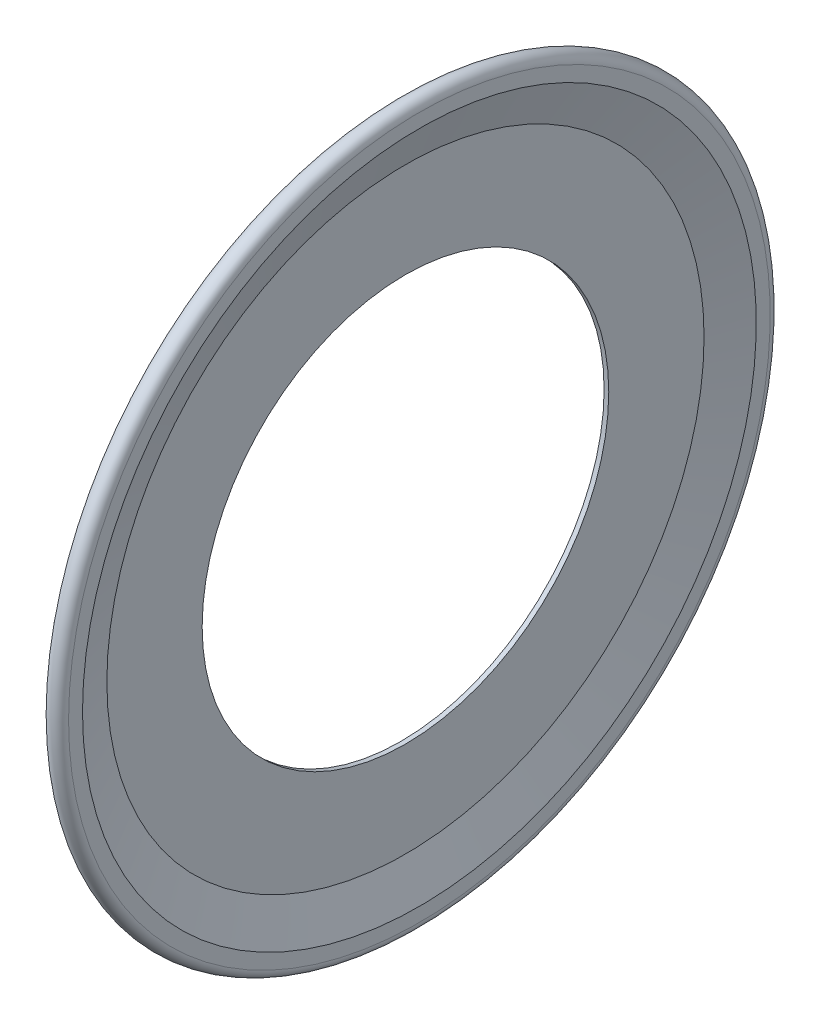
ISO-10303-21;
HEADER;
FILE_DESCRIPTION(('STEP AP214'),'2;1');
FILE_NAME('part.step','',(''),(''),'','','');
FILE_SCHEMA(('AUTOMOTIVE_DESIGN { 1 0 10303 214 1 1 1 1 }'));
ENDSEC;
DATA;
#1=APPLICATION_CONTEXT('core data for automotive mechanical design processes');
#2=APPLICATION_PROTOCOL_DEFINITION('international standard','automotive_design',2000,#1);
#3=PRODUCT_CONTEXT('',#1,'mechanical');
#4=PRODUCT('Part','Part','',(#3));
#5=PRODUCT_RELATED_PRODUCT_CATEGORY('part','',(#4));
#6=PRODUCT_DEFINITION_FORMATION('','',#4);
#7=PRODUCT_DEFINITION_CONTEXT('part definition',#1,'design');
#8=PRODUCT_DEFINITION('design','',#6,#7);
#9=PRODUCT_DEFINITION_SHAPE('','',#8);
#10=(LENGTH_UNIT() NAMED_UNIT(*) SI_UNIT(.MILLI.,.METRE.));
#11=(NAMED_UNIT(*) PLANE_ANGLE_UNIT() SI_UNIT($,.RADIAN.));
#12=(NAMED_UNIT(*) SI_UNIT($,.STERADIAN.) SOLID_ANGLE_UNIT());
#13=UNCERTAINTY_MEASURE_WITH_UNIT(LENGTH_MEASURE(1.E-05),#10,'distance_accuracy_value','');
#14=(GEOMETRIC_REPRESENTATION_CONTEXT(3) GLOBAL_UNCERTAINTY_ASSIGNED_CONTEXT((#13)) GLOBAL_UNIT_ASSIGNED_CONTEXT((#10,
#11,#12)) REPRESENTATION_CONTEXT('',''));
#15=CARTESIAN_POINT('',(0.,0.,0.));
#16=DIRECTION('',(0.,0.,1.));
#17=DIRECTION('',(1.,0.,0.));
#18=AXIS2_PLACEMENT_3D('',#15,#16,#17);
#19=CARTESIAN_POINT('',(-5.6,12.8515135483272,0.));
#20=DIRECTION('',(-1.,0.,0.));
#21=DIRECTION('',(0.,0.,1.));
#22=AXIS2_PLACEMENT_3D('',#19,#20,#21);
#23=PLANE('',#22);
#24=CARTESIAN_POINT('',(-5.6,0.,0.));
#25=DIRECTION('',(-1.,0.,0.));
#26=DIRECTION('',(0.,0.,1.));
#27=AXIS2_PLACEMENT_3D('',#24,#25,#26);
#28=CIRCLE('',#27,12.8515135483272);
#29=CARTESIAN_POINT('',(-5.6,0.,12.8515135483272));
#30=VERTEX_POINT('',#29);
#31=EDGE_CURVE('E10',#30,#30,#28,.T.);
#32=ORIENTED_EDGE('',*,*,#31,.F.);
#33=EDGE_LOOP('',(#32));
#34=FACE_BOUND('',#33,.T.);
#35=CARTESIAN_POINT('',(-5.6,0.,0.));
#36=DIRECTION('',(-1.,0.,0.));
#37=DIRECTION('',(0.,0.,1.));
#38=AXIS2_PLACEMENT_3D('',#35,#36,#37);
#39=CIRCLE('',#38,8.75);
#40=CARTESIAN_POINT('',(-5.6,0.,8.75));
#41=VERTEX_POINT('',#40);
#42=EDGE_CURVE('E75',#41,#41,#39,.T.);
#43=ORIENTED_EDGE('',*,*,#42,.T.);
#44=EDGE_LOOP('',(#43));
#45=FACE_BOUND('',#44,.T.);
#46=ADVANCED_FACE('F35',(#34,#45),#23,.F.);
#47=CARTESIAN_POINT('',(-5.6,0.,0.));
#48=DIRECTION('',(1.,0.,0.));
#49=DIRECTION('',(0.,0.,-1.));
#50=AXIS2_PLACEMENT_3D('',#47,#48,#49);
#51=CONICAL_SURFACE('',#50,12.8515135483272,1.22173047639603);
#52=CARTESIAN_POINT('',(-5.,0.,0.));
#53=DIRECTION('',(-1.,0.,0.));
#54=DIRECTION('',(0.,0.,1.));
#55=AXIS2_PLACEMENT_3D('',#52,#53,#54);
#56=CIRCLE('',#55,14.5);
#57=CARTESIAN_POINT('',(-5.,0.,14.5));
#58=VERTEX_POINT('',#57);
#59=EDGE_CURVE('E41',#58,#58,#56,.T.);
#60=ORIENTED_EDGE('',*,*,#59,.F.);
#61=EDGE_LOOP('',(#60));
#62=FACE_BOUND('',#61,.T.);
#63=ORIENTED_EDGE('',*,*,#31,.T.);
#64=EDGE_LOOP('',(#63));
#65=FACE_BOUND('',#64,.T.);
#66=ADVANCED_FACE('F136',(#62,#65),#51,.F.);
#67=CARTESIAN_POINT('',(-5.,15.1,0.));
#68=DIRECTION('',(-1.,0.,0.));
#69=DIRECTION('',(0.,0.,1.));
#70=AXIS2_PLACEMENT_3D('',#67,#68,#69);
#71=PLANE('',#70);
#72=CARTESIAN_POINT('',(-5.,0.,0.));
#73=DIRECTION('',(-1.,0.,0.));
#74=DIRECTION('',(0.,0.,1.));
#75=AXIS2_PLACEMENT_3D('',#72,#73,#74);
#76=CIRCLE('',#75,15.1);
#77=CARTESIAN_POINT('',(-5.,0.,15.1));
#78=VERTEX_POINT('',#77);
#79=EDGE_CURVE('E45',#78,#78,#76,.T.);
#80=ORIENTED_EDGE('',*,*,#79,.F.);
#81=EDGE_LOOP('',(#80));
#82=FACE_BOUND('',#81,.T.);
#83=ORIENTED_EDGE('',*,*,#59,.T.);
#84=EDGE_LOOP('',(#83));
#85=FACE_BOUND('',#84,.T.);
#86=ADVANCED_FACE('F131',(#82,#85),#71,.F.);
#87=CARTESIAN_POINT('',(-5.4,0.,0.));
#88=DIRECTION('',(-1.,0.,0.));
#89=DIRECTION('',(0.,0.,1.));
#90=AXIS2_PLACEMENT_3D('',#87,#88,#89);
#91=TOROIDAL_SURFACE('',#90,15.1,0.400000000000001);
#92=CARTESIAN_POINT('',(-5.8,0.,0.));
#93=DIRECTION('',(-1.,0.,0.));
#94=DIRECTION('',(0.,0.,1.));
#95=AXIS2_PLACEMENT_3D('',#92,#93,#94);
#96=CIRCLE('',#95,15.1);
#97=CARTESIAN_POINT('',(-5.8,0.,15.1));
#98=VERTEX_POINT('',#97);
#99=EDGE_CURVE('E49',#98,#98,#96,.T.);
#100=ORIENTED_EDGE('',*,*,#99,.F.);
#101=EDGE_LOOP('',(#100));
#102=FACE_BOUND('',#101,.T.);
#103=ORIENTED_EDGE('',*,*,#79,.T.);
#104=EDGE_LOOP('',(#103));
#105=FACE_BOUND('',#104,.T.);
#106=ADVANCED_FACE('F125',(#102,#105),#91,.T.);
#107=CARTESIAN_POINT('',(-5.8,15.1,0.));
#108=DIRECTION('',(1.,0.,0.));
#109=DIRECTION('',(0.,0.,-1.));
#110=AXIS2_PLACEMENT_3D('',#107,#108,#109);
#111=PLANE('',#110);
#112=CARTESIAN_POINT('',(-5.8,0.,0.));
#113=DIRECTION('',(-1.,0.,0.));
#114=DIRECTION('',(0.,0.,1.));
#115=AXIS2_PLACEMENT_3D('',#112,#113,#114);
#116=CIRCLE('',#115,14.5);
#117=CARTESIAN_POINT('',(-5.8,0.,14.5));
#118=VERTEX_POINT('',#117);
#119=EDGE_CURVE('E54',#118,#118,#116,.T.);
#120=ORIENTED_EDGE('',*,*,#119,.F.);
#121=EDGE_LOOP('',(#120));
#122=FACE_BOUND('',#121,.T.);
#123=ORIENTED_EDGE('',*,*,#99,.T.);
#124=EDGE_LOOP('',(#123));
#125=FACE_BOUND('',#124,.T.);
#126=ADVANCED_FACE('F119',(#122,#125),#111,.F.);
#127=CARTESIAN_POINT('',(-6.,0.,0.));
#128=DIRECTION('',(-1.,0.,0.));
#129=DIRECTION('',(0.,0.,1.));
#130=AXIS2_PLACEMENT_3D('',#127,#128,#129);
#131=CYLINDRICAL_SURFACE('',#130,14.5);
#132=CARTESIAN_POINT('',(-5.6,0.,0.));
#133=DIRECTION('',(-1.,0.,0.));
#134=DIRECTION('',(0.,0.,1.));
#135=AXIS2_PLACEMENT_3D('',#132,#133,#134);
#136=CIRCLE('',#135,14.5);
#137=CARTESIAN_POINT('',(-5.6,0.,14.5));
#138=VERTEX_POINT('',#137);
#139=EDGE_CURVE('E57',#138,#138,#136,.T.);
#140=ORIENTED_EDGE('',*,*,#139,.F.);
#141=EDGE_LOOP('',(#140));
#142=FACE_BOUND('',#141,.T.);
#143=ORIENTED_EDGE('',*,*,#119,.T.);
#144=EDGE_LOOP('',(#143));
#145=FACE_BOUND('',#144,.T.);
#146=ADVANCED_FACE('F113',(#142,#145),#131,.F.);
#147=CARTESIAN_POINT('',(-5.6,15.1,0.));
#148=DIRECTION('',(-1.,0.,0.));
#149=DIRECTION('',(0.,0.,1.));
#150=AXIS2_PLACEMENT_3D('',#147,#148,#149);
#151=PLANE('',#150);
#152=CARTESIAN_POINT('',(-5.6,0.,0.));
#153=DIRECTION('',(-1.,0.,0.));
#154=DIRECTION('',(0.,0.,1.));
#155=AXIS2_PLACEMENT_3D('',#152,#153,#154);
#156=CIRCLE('',#155,15.1);
#157=CARTESIAN_POINT('',(-5.6,0.,15.1));
#158=VERTEX_POINT('',#157);
#159=EDGE_CURVE('E60',#158,#158,#156,.T.);
#160=ORIENTED_EDGE('',*,*,#159,.F.);
#161=EDGE_LOOP('',(#160));
#162=FACE_BOUND('',#161,.T.);
#163=ORIENTED_EDGE('',*,*,#139,.T.);
#164=EDGE_LOOP('',(#163));
#165=FACE_BOUND('',#164,.T.);
#166=ADVANCED_FACE('F107',(#162,#165),#151,.F.);
#167=CARTESIAN_POINT('',(-5.4,0.,0.));
#168=DIRECTION('',(-1.,0.,0.));
#169=DIRECTION('',(0.,0.,1.));
#170=AXIS2_PLACEMENT_3D('',#167,#168,#169);
#171=TOROIDAL_SURFACE('',#170,15.1,0.200000000000001);
#172=CARTESIAN_POINT('',(-5.2,0.,0.));
#173=DIRECTION('',(-1.,0.,0.));
#174=DIRECTION('',(0.,0.,1.));
#175=AXIS2_PLACEMENT_3D('',#172,#173,#174);
#176=CIRCLE('',#175,15.1);
#177=CARTESIAN_POINT('',(-5.2,0.,15.1));
#178=VERTEX_POINT('',#177);
#179=EDGE_CURVE('E63',#178,#178,#176,.T.);
#180=ORIENTED_EDGE('',*,*,#179,.F.);
#181=EDGE_LOOP('',(#180));
#182=FACE_BOUND('',#181,.T.);
#183=ORIENTED_EDGE('',*,*,#159,.T.);
#184=EDGE_LOOP('',(#183));
#185=FACE_BOUND('',#184,.T.);
#186=ADVANCED_FACE('F101',(#182,#185),#171,.F.);
#187=CARTESIAN_POINT('',(-5.2,15.1,0.));
#188=DIRECTION('',(1.,0.,0.));
#189=DIRECTION('',(0.,0.,-1.));
#190=AXIS2_PLACEMENT_3D('',#187,#188,#189);
#191=PLANE('',#190);
#192=CARTESIAN_POINT('',(-5.2,0.,0.));
#193=DIRECTION('',(-1.,0.,0.));
#194=DIRECTION('',(0.,0.,1.));
#195=AXIS2_PLACEMENT_3D('',#192,#193,#194);
#196=CIRCLE('',#195,14.5352653961417);
#197=CARTESIAN_POINT('',(-5.2,0.,14.5352653961417));
#198=VERTEX_POINT('',#197);
#199=EDGE_CURVE('E66',#198,#198,#196,.T.);
#200=ORIENTED_EDGE('',*,*,#199,.F.);
#201=EDGE_LOOP('',(#200));
#202=FACE_BOUND('',#201,.T.);
#203=ORIENTED_EDGE('',*,*,#179,.T.);
#204=EDGE_LOOP('',(#203));
#205=FACE_BOUND('',#204,.T.);
#206=ADVANCED_FACE('F95',(#202,#205),#191,.F.);
#207=CARTESIAN_POINT('',(-5.2,0.,0.));
#208=DIRECTION('',(1.,0.,0.));
#209=DIRECTION('',(0.,0.,-1.));
#210=AXIS2_PLACEMENT_3D('',#207,#208,#209);
#211=CONICAL_SURFACE('',#210,14.5352653961417,1.22173047639603);
#212=CARTESIAN_POINT('',(-5.8,0.,0.));
#213=DIRECTION('',(-1.,0.,0.));
#214=DIRECTION('',(0.,0.,1.));
#215=AXIS2_PLACEMENT_3D('',#212,#213,#214);
#216=CIRCLE('',#215,12.8867789444689);
#217=CARTESIAN_POINT('',(-5.8,0.,12.8867789444689));
#218=VERTEX_POINT('',#217);
#219=EDGE_CURVE('E69',#218,#218,#216,.T.);
#220=ORIENTED_EDGE('',*,*,#219,.F.);
#221=EDGE_LOOP('',(#220));
#222=FACE_BOUND('',#221,.T.);
#223=ORIENTED_EDGE('',*,*,#199,.T.);
#224=EDGE_LOOP('',(#223));
#225=FACE_BOUND('',#224,.T.);
#226=ADVANCED_FACE('F89',(#222,#225),#211,.T.);
#227=CARTESIAN_POINT('',(-5.8,9.,0.));
#228=DIRECTION('',(1.,0.,0.));
#229=DIRECTION('',(0.,0.,-1.));
#230=AXIS2_PLACEMENT_3D('',#227,#228,#229);
#231=PLANE('',#230);
#232=CARTESIAN_POINT('',(-5.80000000000001,0.,0.));
#233=DIRECTION('',(-1.,0.,0.));
#234=DIRECTION('',(0.,0.,1.));
#235=AXIS2_PLACEMENT_3D('',#232,#233,#234);
#236=CIRCLE('',#235,8.75);
#237=CARTESIAN_POINT('',(-5.80000000000001,0.,8.75));
#238=VERTEX_POINT('',#237);
#239=EDGE_CURVE('E72',#238,#238,#236,.T.);
#240=ORIENTED_EDGE('',*,*,#239,.F.);
#241=EDGE_LOOP('',(#240));
#242=FACE_BOUND('',#241,.T.);
#243=ORIENTED_EDGE('',*,*,#219,.T.);
#244=EDGE_LOOP('',(#243));
#245=FACE_BOUND('',#244,.T.);
#246=ADVANCED_FACE('F83',(#242,#245),#231,.F.);
#247=CARTESIAN_POINT('',(-6.,0.,0.));
#248=DIRECTION('',(-1.,0.,0.));
#249=DIRECTION('',(0.,0.,1.));
#250=AXIS2_PLACEMENT_3D('',#247,#248,#249);
#251=CYLINDRICAL_SURFACE('',#250,8.75);
#252=ORIENTED_EDGE('',*,*,#42,.F.);
#253=EDGE_LOOP('',(#252));
#254=FACE_BOUND('',#253,.T.);
#255=ORIENTED_EDGE('',*,*,#239,.T.);
#256=EDGE_LOOP('',(#255));
#257=FACE_BOUND('',#256,.T.);
#258=ADVANCED_FACE('F80',(#254,#257),#251,.F.);
#259=CLOSED_SHELL('',(#46,#66,#86,#106,#126,#146,#166,#186,#206,#226,#246,#258));
#260=MANIFOLD_SOLID_BREP('B2',#259);
#261=ADVANCED_BREP_SHAPE_REPRESENTATION('',(#18,#260),#14);
#262=SHAPE_DEFINITION_REPRESENTATION(#9,#261);
ENDSEC;
END-ISO-10303-21;
